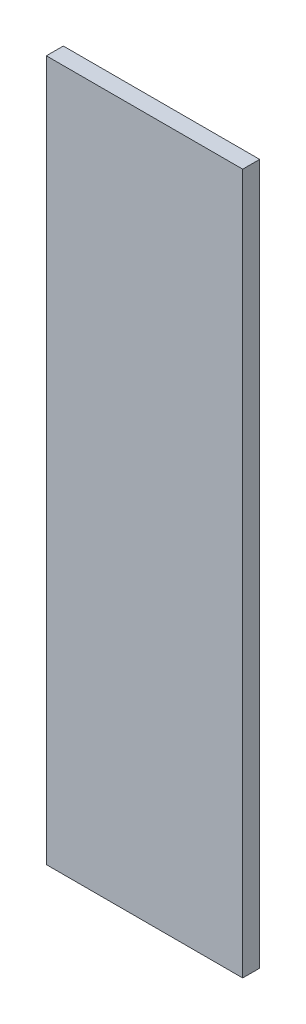
ISO-10303-21;
HEADER;
FILE_DESCRIPTION(('STEP AP214'),'2;1');
FILE_NAME('part.step','',(''),(''),'','','');
FILE_SCHEMA(('AUTOMOTIVE_DESIGN { 1 0 10303 214 1 1 1 1 }'));
ENDSEC;
DATA;
#1=APPLICATION_CONTEXT('core data for automotive mechanical design processes');
#2=APPLICATION_PROTOCOL_DEFINITION('international standard','automotive_design',2000,#1);
#3=PRODUCT_CONTEXT('',#1,'mechanical');
#4=PRODUCT('Part','Part','',(#3));
#5=PRODUCT_RELATED_PRODUCT_CATEGORY('part','',(#4));
#6=PRODUCT_DEFINITION_FORMATION('','',#4);
#7=PRODUCT_DEFINITION_CONTEXT('part definition',#1,'design');
#8=PRODUCT_DEFINITION('design','',#6,#7);
#9=PRODUCT_DEFINITION_SHAPE('','',#8);
#10=(LENGTH_UNIT() NAMED_UNIT(*) SI_UNIT(.MILLI.,.METRE.));
#11=(NAMED_UNIT(*) PLANE_ANGLE_UNIT() SI_UNIT($,.RADIAN.));
#12=(NAMED_UNIT(*) SI_UNIT($,.STERADIAN.) SOLID_ANGLE_UNIT());
#13=UNCERTAINTY_MEASURE_WITH_UNIT(LENGTH_MEASURE(1.E-05),#10,'distance_accuracy_value','');
#14=(GEOMETRIC_REPRESENTATION_CONTEXT(3) GLOBAL_UNCERTAINTY_ASSIGNED_CONTEXT((#13)) GLOBAL_UNIT_ASSIGNED_CONTEXT((#10,
#11,#12)) REPRESENTATION_CONTEXT('',''));
#15=CARTESIAN_POINT('',(0.,0.,0.));
#16=DIRECTION('',(0.,0.,1.));
#17=DIRECTION('',(1.,0.,0.));
#18=AXIS2_PLACEMENT_3D('',#15,#16,#17);
#19=CARTESIAN_POINT('',(0.,0.,19.05));
#20=DIRECTION('',(1.,0.,0.));
#21=DIRECTION('',(0.,0.,-1.));
#22=AXIS2_PLACEMENT_3D('',#19,#20,#21);
#23=PLANE('',#22);
#24=DIRECTION('',(0.,-1.,0.));
#25=VECTOR('',#24,1.);
#26=CARTESIAN_POINT('',(0.,0.,0.));
#27=LINE('',#26,#25);
#28=CARTESIAN_POINT('',(0.,787.4,0.));
#29=VERTEX_POINT('',#28);
#30=CARTESIAN_POINT('',(0.,0.,0.));
#31=VERTEX_POINT('',#30);
#32=EDGE_CURVE('E96',#29,#31,#27,.T.);
#33=ORIENTED_EDGE('',*,*,#32,.T.);
#34=DIRECTION('',(0.,0.,-1.));
#35=VECTOR('',#34,1.);
#36=CARTESIAN_POINT('',(0.,0.,19.05));
#37=LINE('',#36,#35);
#38=CARTESIAN_POINT('',(0.,0.,19.05));
#39=VERTEX_POINT('',#38);
#40=EDGE_CURVE('E11',#39,#31,#37,.T.);
#41=ORIENTED_EDGE('',*,*,#40,.F.);
#42=DIRECTION('',(0.,-1.,0.));
#43=VECTOR('',#42,1.);
#44=CARTESIAN_POINT('',(0.,0.,19.05));
#45=LINE('',#44,#43);
#46=CARTESIAN_POINT('',(0.,787.4,19.05));
#47=VERTEX_POINT('',#46);
#48=EDGE_CURVE('E84',#47,#39,#45,.T.);
#49=ORIENTED_EDGE('',*,*,#48,.F.);
#50=DIRECTION('',(0.,0.,-1.));
#51=VECTOR('',#50,1.);
#52=CARTESIAN_POINT('',(0.,787.4,19.05));
#53=LINE('',#52,#51);
#54=EDGE_CURVE('E92',#47,#29,#53,.T.);
#55=ORIENTED_EDGE('',*,*,#54,.T.);
#56=EDGE_LOOP('',(#33,#41,#49,#55));
#57=FACE_BOUND('',#56,.T.);
#58=ADVANCED_FACE('F33',(#57),#23,.F.);
#59=CARTESIAN_POINT('',(0.,0.,19.05));
#60=DIRECTION('',(0.,1.,0.));
#61=DIRECTION('',(0.,0.,1.));
#62=AXIS2_PLACEMENT_3D('',#59,#60,#61);
#63=PLANE('',#62);
#64=DIRECTION('',(1.,0.,0.));
#65=VECTOR('',#64,1.);
#66=CARTESIAN_POINT('',(0.,0.,0.));
#67=LINE('',#66,#65);
#68=CARTESIAN_POINT('',(220.726,0.,0.));
#69=VERTEX_POINT('',#68);
#70=EDGE_CURVE('E88',#31,#69,#67,.T.);
#71=ORIENTED_EDGE('',*,*,#70,.T.);
#72=DIRECTION('',(0.,0.,-1.));
#73=VECTOR('',#72,1.);
#74=CARTESIAN_POINT('',(220.726,0.,19.05));
#75=LINE('',#74,#73);
#76=CARTESIAN_POINT('',(220.726,0.,19.05));
#77=VERTEX_POINT('',#76);
#78=EDGE_CURVE('E41',#77,#69,#75,.T.);
#79=ORIENTED_EDGE('',*,*,#78,.F.);
#80=DIRECTION('',(1.,0.,0.));
#81=VECTOR('',#80,1.);
#82=CARTESIAN_POINT('',(0.,0.,19.05));
#83=LINE('',#82,#81);
#84=EDGE_CURVE('E79',#39,#77,#83,.T.);
#85=ORIENTED_EDGE('',*,*,#84,.F.);
#86=ORIENTED_EDGE('',*,*,#40,.T.);
#87=EDGE_LOOP('',(#71,#79,#85,#86));
#88=FACE_BOUND('',#87,.T.);
#89=ADVANCED_FACE('F87',(#88),#63,.F.);
#90=CARTESIAN_POINT('',(220.726,0.,19.05));
#91=DIRECTION('',(-1.,0.,0.));
#92=DIRECTION('',(0.,0.,1.));
#93=AXIS2_PLACEMENT_3D('',#90,#91,#92);
#94=PLANE('',#93);
#95=DIRECTION('',(0.,1.,0.));
#96=VECTOR('',#95,1.);
#97=CARTESIAN_POINT('',(220.726,0.,0.));
#98=LINE('',#97,#96);
#99=CARTESIAN_POINT('',(220.726,787.4,0.));
#100=VERTEX_POINT('',#99);
#101=EDGE_CURVE('E66',#69,#100,#98,.T.);
#102=ORIENTED_EDGE('',*,*,#101,.T.);
#103=DIRECTION('',(0.,0.,-1.));
#104=VECTOR('',#103,1.);
#105=CARTESIAN_POINT('',(220.726,787.4,19.05));
#106=LINE('',#105,#104);
#107=CARTESIAN_POINT('',(220.726,787.4,19.05));
#108=VERTEX_POINT('',#107);
#109=EDGE_CURVE('E89',#108,#100,#106,.T.);
#110=ORIENTED_EDGE('',*,*,#109,.F.);
#111=DIRECTION('',(0.,1.,0.));
#112=VECTOR('',#111,1.);
#113=CARTESIAN_POINT('',(220.726,0.,19.05));
#114=LINE('',#113,#112);
#115=EDGE_CURVE('E82',#77,#108,#114,.T.);
#116=ORIENTED_EDGE('',*,*,#115,.F.);
#117=ORIENTED_EDGE('',*,*,#78,.T.);
#118=EDGE_LOOP('',(#102,#110,#116,#117));
#119=FACE_BOUND('',#118,.T.);
#120=ADVANCED_FACE('F90',(#119),#94,.F.);
#121=CARTESIAN_POINT('',(0.,787.4,19.05));
#122=DIRECTION('',(0.,-1.,0.));
#123=DIRECTION('',(0.,0.,-1.));
#124=AXIS2_PLACEMENT_3D('',#121,#122,#123);
#125=PLANE('',#124);
#126=DIRECTION('',(-1.,0.,0.));
#127=VECTOR('',#126,1.);
#128=CARTESIAN_POINT('',(0.,787.4,0.));
#129=LINE('',#128,#127);
#130=EDGE_CURVE('E72',#100,#29,#129,.T.);
#131=ORIENTED_EDGE('',*,*,#130,.T.);
#132=ORIENTED_EDGE('',*,*,#54,.F.);
#133=DIRECTION('',(-1.,0.,0.));
#134=VECTOR('',#133,1.);
#135=CARTESIAN_POINT('',(0.,787.4,19.05));
#136=LINE('',#135,#134);
#137=EDGE_CURVE('E49',#108,#47,#136,.T.);
#138=ORIENTED_EDGE('',*,*,#137,.F.);
#139=ORIENTED_EDGE('',*,*,#109,.T.);
#140=EDGE_LOOP('',(#131,#132,#138,#139));
#141=FACE_BOUND('',#140,.T.);
#142=ADVANCED_FACE('F103',(#141),#125,.F.);
#143=CARTESIAN_POINT('',(0.,0.,19.05));
#144=DIRECTION('',(0.,0.,-1.));
#145=DIRECTION('',(-1.,0.,0.));
#146=AXIS2_PLACEMENT_3D('',#143,#144,#145);
#147=PLANE('',#146);
#148=ORIENTED_EDGE('',*,*,#48,.T.);
#149=ORIENTED_EDGE('',*,*,#84,.T.);
#150=ORIENTED_EDGE('',*,*,#115,.T.);
#151=ORIENTED_EDGE('',*,*,#137,.T.);
#152=EDGE_LOOP('',(#148,#149,#150,#151));
#153=FACE_BOUND('',#152,.T.);
#154=ADVANCED_FACE('F80',(#153),#147,.F.);
#155=CARTESIAN_POINT('',(0.,0.,0.));
#156=DIRECTION('',(0.,0.,-1.));
#157=DIRECTION('',(-1.,0.,0.));
#158=AXIS2_PLACEMENT_3D('',#155,#156,#157);
#159=PLANE('',#158);
#160=ORIENTED_EDGE('',*,*,#32,.F.);
#161=ORIENTED_EDGE('',*,*,#130,.F.);
#162=ORIENTED_EDGE('',*,*,#101,.F.);
#163=ORIENTED_EDGE('',*,*,#70,.F.);
#164=EDGE_LOOP('',(#160,#161,#162,#163));
#165=FACE_BOUND('',#164,.T.);
#166=ADVANCED_FACE('F106',(#165),#159,.T.);
#167=CLOSED_SHELL('',(#58,#89,#120,#142,#154,#166));
#168=MANIFOLD_SOLID_BREP('B2',#167);
#169=ADVANCED_BREP_SHAPE_REPRESENTATION('',(#18,#168),#14);
#170=SHAPE_DEFINITION_REPRESENTATION(#9,#169);
ENDSEC;
END-ISO-10303-21;
